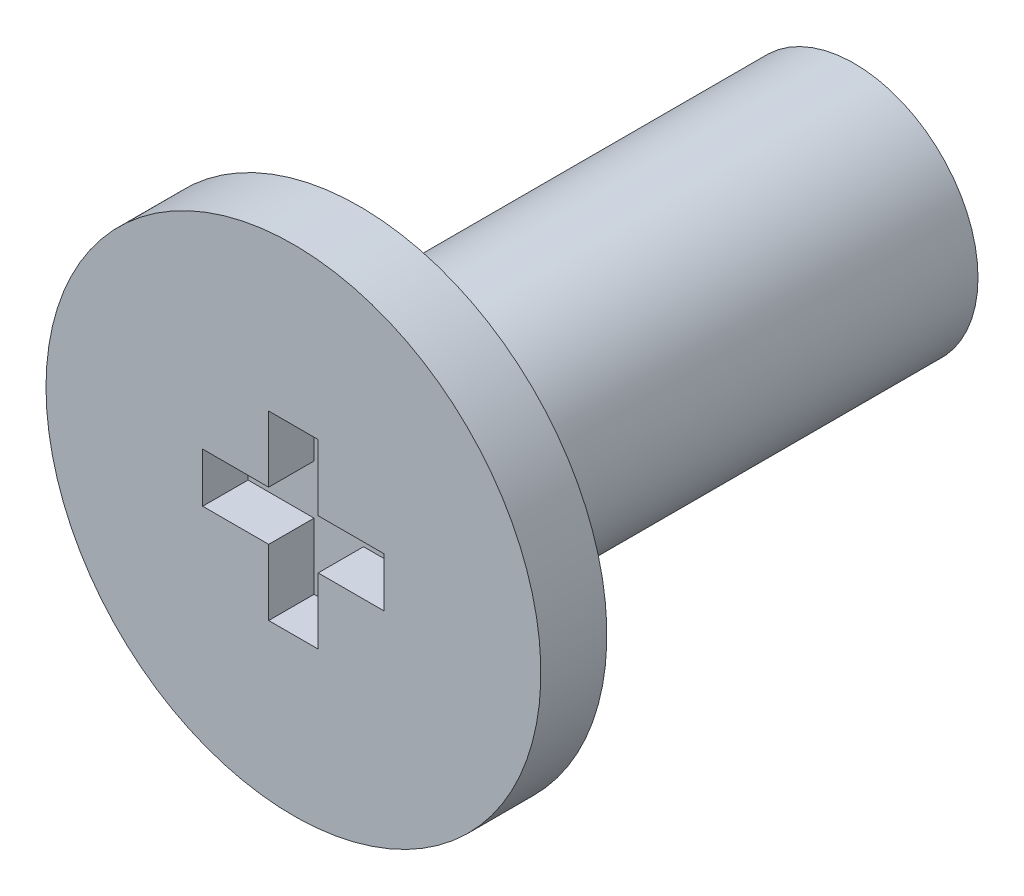
ISO-10303-21;
HEADER;
FILE_DESCRIPTION(('STEP AP214'),'2;1');
FILE_NAME('part.step','',(''),(''),'','','');
FILE_SCHEMA(('AUTOMOTIVE_DESIGN { 1 0 10303 214 1 1 1 1 }'));
ENDSEC;
DATA;
#1=APPLICATION_CONTEXT('core data for automotive mechanical design processes');
#2=APPLICATION_PROTOCOL_DEFINITION('international standard','automotive_design',2000,#1);
#3=PRODUCT_CONTEXT('',#1,'mechanical');
#4=PRODUCT('Part','Part','',(#3));
#5=PRODUCT_RELATED_PRODUCT_CATEGORY('part','',(#4));
#6=PRODUCT_DEFINITION_FORMATION('','',#4);
#7=PRODUCT_DEFINITION_CONTEXT('part definition',#1,'design');
#8=PRODUCT_DEFINITION('design','',#6,#7);
#9=PRODUCT_DEFINITION_SHAPE('','',#8);
#10=(LENGTH_UNIT() NAMED_UNIT(*) SI_UNIT(.MILLI.,.METRE.));
#11=(NAMED_UNIT(*) PLANE_ANGLE_UNIT() SI_UNIT($,.RADIAN.));
#12=(NAMED_UNIT(*) SI_UNIT($,.STERADIAN.) SOLID_ANGLE_UNIT());
#13=UNCERTAINTY_MEASURE_WITH_UNIT(LENGTH_MEASURE(1.E-05),#10,'distance_accuracy_value','');
#14=(GEOMETRIC_REPRESENTATION_CONTEXT(3) GLOBAL_UNCERTAINTY_ASSIGNED_CONTEXT((#13)) GLOBAL_UNIT_ASSIGNED_CONTEXT((#10,
#11,#12)) REPRESENTATION_CONTEXT('',''));
#15=CARTESIAN_POINT('',(0.,0.,0.));
#16=DIRECTION('',(0.,0.,1.));
#17=DIRECTION('',(1.,0.,0.));
#18=AXIS2_PLACEMENT_3D('',#15,#16,#17);
#19=CARTESIAN_POINT('',(0.,0.,-6.));
#20=DIRECTION('',(0.,0.,1.));
#21=DIRECTION('',(1.,0.,0.));
#22=AXIS2_PLACEMENT_3D('',#19,#20,#21);
#23=CYLINDRICAL_SURFACE('',#22,1.5);
#24=CARTESIAN_POINT('',(0.,0.,-6.));
#25=DIRECTION('',(0.,0.,1.));
#26=DIRECTION('',(1.,0.,0.));
#27=AXIS2_PLACEMENT_3D('',#24,#25,#26);
#28=CIRCLE('',#27,1.5);
#29=CARTESIAN_POINT('',(1.5,0.,-6.));
#30=VERTEX_POINT('',#29);
#31=EDGE_CURVE('E212',#30,#30,#28,.T.);
#32=ORIENTED_EDGE('',*,*,#31,.T.);
#33=EDGE_LOOP('',(#32));
#34=FACE_BOUND('',#33,.T.);
#35=CARTESIAN_POINT('',(0.,0.,0.));
#36=DIRECTION('',(0.,0.,1.));
#37=DIRECTION('',(1.,0.,0.));
#38=AXIS2_PLACEMENT_3D('',#35,#36,#37);
#39=CIRCLE('',#38,1.5);
#40=CARTESIAN_POINT('',(1.5,0.,0.));
#41=VERTEX_POINT('',#40);
#42=EDGE_CURVE('E208',#41,#41,#39,.T.);
#43=ORIENTED_EDGE('',*,*,#42,.F.);
#44=EDGE_LOOP('',(#43));
#45=FACE_BOUND('',#44,.T.);
#46=ADVANCED_FACE('F41',(#34,#45),#23,.T.);
#47=CARTESIAN_POINT('',(0.,0.,-6.));
#48=DIRECTION('',(0.,0.,1.));
#49=DIRECTION('',(1.,0.,0.));
#50=AXIS2_PLACEMENT_3D('',#47,#48,#49);
#51=PLANE('',#50);
#52=ORIENTED_EDGE('',*,*,#31,.F.);
#53=EDGE_LOOP('',(#52));
#54=FACE_BOUND('',#53,.T.);
#55=ADVANCED_FACE('F281',(#54),#51,.F.);
#56=CARTESIAN_POINT('',(0.,0.,0.));
#57=DIRECTION('',(0.,0.,1.));
#58=DIRECTION('',(1.,0.,0.));
#59=AXIS2_PLACEMENT_3D('',#56,#57,#58);
#60=PLANE('',#59);
#61=ORIENTED_EDGE('',*,*,#42,.T.);
#62=EDGE_LOOP('',(#61));
#63=FACE_BOUND('',#62,.T.);
#64=CARTESIAN_POINT('',(0.,0.,0.));
#65=DIRECTION('',(0.,0.,-1.));
#66=DIRECTION('',(-1.,0.,0.));
#67=AXIS2_PLACEMENT_3D('',#64,#65,#66);
#68=CIRCLE('',#67,3.);
#69=CARTESIAN_POINT('',(-3.,0.,0.));
#70=VERTEX_POINT('',#69);
#71=EDGE_CURVE('E210',#70,#70,#68,.T.);
#72=ORIENTED_EDGE('',*,*,#71,.T.);
#73=EDGE_LOOP('',(#72));
#74=FACE_BOUND('',#73,.T.);
#75=ADVANCED_FACE('F286',(#63,#74),#60,.F.);
#76=CARTESIAN_POINT('',(0.,0.,-2.));
#77=DIRECTION('',(0.,0.,-1.));
#78=DIRECTION('',(-1.,0.,0.));
#79=AXIS2_PLACEMENT_3D('',#76,#77,#78);
#80=CYLINDRICAL_SURFACE('',#79,3.);
#81=ORIENTED_EDGE('',*,*,#71,.F.);
#82=EDGE_LOOP('',(#81));
#83=FACE_BOUND('',#82,.T.);
#84=CARTESIAN_POINT('',(0.,0.,0.8));
#85=DIRECTION('',(0.,0.,-1.));
#86=DIRECTION('',(-1.,0.,0.));
#87=AXIS2_PLACEMENT_3D('',#84,#85,#86);
#88=CIRCLE('',#87,3.);
#89=CARTESIAN_POINT('',(-3.,0.,0.8));
#90=VERTEX_POINT('',#89);
#91=EDGE_CURVE('E179',#90,#90,#88,.T.);
#92=ORIENTED_EDGE('',*,*,#91,.T.);
#93=EDGE_LOOP('',(#92));
#94=FACE_BOUND('',#93,.T.);
#95=ADVANCED_FACE('F300',(#83,#94),#80,.T.);
#96=CARTESIAN_POINT('',(3.,0.,0.8));
#97=DIRECTION('',(0.,0.,-1.));
#98=DIRECTION('',(-1.,0.,0.));
#99=AXIS2_PLACEMENT_3D('',#96,#97,#98);
#100=PLANE('',#99);
#101=DIRECTION('',(-1.,0.,0.));
#102=VECTOR('',#101,1.);
#103=CARTESIAN_POINT('',(3.,-1.1,0.8));
#104=LINE('',#103,#102);
#105=CARTESIAN_POINT('',(0.3,-1.1,0.8));
#106=VERTEX_POINT('',#105);
#107=CARTESIAN_POINT('',(-0.3,-1.1,0.8));
#108=VERTEX_POINT('',#107);
#109=EDGE_CURVE('E211',#106,#108,#104,.T.);
#110=ORIENTED_EDGE('',*,*,#109,.T.);
#111=DIRECTION('',(0.,1.,0.));
#112=VECTOR('',#111,1.);
#113=CARTESIAN_POINT('',(-0.3,0.,0.8));
#114=LINE('',#113,#112);
#115=CARTESIAN_POINT('',(-0.3,-0.3,0.8));
#116=VERTEX_POINT('',#115);
#117=EDGE_CURVE('E11',#108,#116,#114,.T.);
#118=ORIENTED_EDGE('',*,*,#117,.T.);
#119=DIRECTION('',(-1.,0.,0.));
#120=VECTOR('',#119,1.);
#121=CARTESIAN_POINT('',(3.,-0.3,0.8));
#122=LINE('',#121,#120);
#123=CARTESIAN_POINT('',(-1.1,-0.3,0.8));
#124=VERTEX_POINT('',#123);
#125=EDGE_CURVE('E48',#116,#124,#122,.T.);
#126=ORIENTED_EDGE('',*,*,#125,.T.);
#127=DIRECTION('',(0.,1.,0.));
#128=VECTOR('',#127,1.);
#129=CARTESIAN_POINT('',(-1.1,0.,0.8));
#130=LINE('',#129,#128);
#131=CARTESIAN_POINT('',(-1.1,0.3,0.8));
#132=VERTEX_POINT('',#131);
#133=EDGE_CURVE('E241',#124,#132,#130,.T.);
#134=ORIENTED_EDGE('',*,*,#133,.T.);
#135=DIRECTION('',(1.,0.,0.));
#136=VECTOR('',#135,1.);
#137=CARTESIAN_POINT('',(3.,0.3,0.8));
#138=LINE('',#137,#136);
#139=CARTESIAN_POINT('',(-0.3,0.3,0.8));
#140=VERTEX_POINT('',#139);
#141=EDGE_CURVE('E236',#132,#140,#138,.T.);
#142=ORIENTED_EDGE('',*,*,#141,.T.);
#143=DIRECTION('',(0.,1.,0.));
#144=VECTOR('',#143,1.);
#145=CARTESIAN_POINT('',(-0.3,0.,0.8));
#146=LINE('',#145,#144);
#147=CARTESIAN_POINT('',(-0.3,1.1,0.8));
#148=VERTEX_POINT('',#147);
#149=EDGE_CURVE('E237',#140,#148,#146,.T.);
#150=ORIENTED_EDGE('',*,*,#149,.T.);
#151=DIRECTION('',(1.,0.,0.));
#152=VECTOR('',#151,1.);
#153=CARTESIAN_POINT('',(3.,1.1,0.8));
#154=LINE('',#153,#152);
#155=CARTESIAN_POINT('',(0.3,1.1,0.8));
#156=VERTEX_POINT('',#155);
#157=EDGE_CURVE('E231',#148,#156,#154,.T.);
#158=ORIENTED_EDGE('',*,*,#157,.T.);
#159=DIRECTION('',(0.,-1.,0.));
#160=VECTOR('',#159,1.);
#161=CARTESIAN_POINT('',(0.3,0.,0.8));
#162=LINE('',#161,#160);
#163=CARTESIAN_POINT('',(0.3,0.3,0.8));
#164=VERTEX_POINT('',#163);
#165=EDGE_CURVE('E228',#156,#164,#162,.T.);
#166=ORIENTED_EDGE('',*,*,#165,.T.);
#167=DIRECTION('',(1.,0.,0.));
#168=VECTOR('',#167,1.);
#169=CARTESIAN_POINT('',(3.,0.3,0.8));
#170=LINE('',#169,#168);
#171=CARTESIAN_POINT('',(1.1,0.3,0.8));
#172=VERTEX_POINT('',#171);
#173=EDGE_CURVE('E229',#164,#172,#170,.T.);
#174=ORIENTED_EDGE('',*,*,#173,.T.);
#175=DIRECTION('',(0.,-1.,0.));
#176=VECTOR('',#175,1.);
#177=CARTESIAN_POINT('',(1.1,0.,0.8));
#178=LINE('',#177,#176);
#179=CARTESIAN_POINT('',(1.1,-0.3,0.8));
#180=VERTEX_POINT('',#179);
#181=EDGE_CURVE('E224',#172,#180,#178,.T.);
#182=ORIENTED_EDGE('',*,*,#181,.T.);
#183=DIRECTION('',(-1.,0.,0.));
#184=VECTOR('',#183,1.);
#185=CARTESIAN_POINT('',(3.,-0.3,0.8));
#186=LINE('',#185,#184);
#187=CARTESIAN_POINT('',(0.3,-0.3,0.8));
#188=VERTEX_POINT('',#187);
#189=EDGE_CURVE('E222',#180,#188,#186,.T.);
#190=ORIENTED_EDGE('',*,*,#189,.T.);
#191=DIRECTION('',(0.,-1.,0.));
#192=VECTOR('',#191,1.);
#193=CARTESIAN_POINT('',(0.3,0.,0.8));
#194=LINE('',#193,#192);
#195=EDGE_CURVE('E220',#188,#106,#194,.T.);
#196=ORIENTED_EDGE('',*,*,#195,.T.);
#197=EDGE_LOOP('',(#110,#118,#126,#134,#142,#150,#158,#166,#174,#182,#190,#196));
#198=FACE_BOUND('',#197,.T.);
#199=ORIENTED_EDGE('',*,*,#91,.F.);
#200=EDGE_LOOP('',(#199));
#201=FACE_BOUND('',#200,.T.);
#202=ADVANCED_FACE('F242',(#198,#201),#100,.F.);
#203=CARTESIAN_POINT('',(-0.3,-0.3,0.25));
#204=DIRECTION('',(-1.,0.,0.));
#205=DIRECTION('',(0.,0.,1.));
#206=AXIS2_PLACEMENT_3D('',#203,#204,#205);
#207=PLANE('',#206);
#208=DIRECTION('',(0.,0.,1.));
#209=VECTOR('',#208,1.);
#210=CARTESIAN_POINT('',(-0.3,-1.1,0.25));
#211=LINE('',#210,#209);
#212=CARTESIAN_POINT('',(-0.3,-1.1,0.25));
#213=VERTEX_POINT('',#212);
#214=EDGE_CURVE('E54',#213,#108,#211,.T.);
#215=ORIENTED_EDGE('',*,*,#214,.F.);
#216=DIRECTION('',(0.,-1.,0.));
#217=VECTOR('',#216,1.);
#218=CARTESIAN_POINT('',(-0.3,-0.3,0.25));
#219=LINE('',#218,#217);
#220=CARTESIAN_POINT('',(-0.3,-0.3,0.25));
#221=VERTEX_POINT('',#220);
#222=EDGE_CURVE('E129',#221,#213,#219,.T.);
#223=ORIENTED_EDGE('',*,*,#222,.F.);
#224=DIRECTION('',(0.,0.,1.));
#225=VECTOR('',#224,1.);
#226=CARTESIAN_POINT('',(-0.3,-0.3,0.25));
#227=LINE('',#226,#225);
#228=EDGE_CURVE('E171',#221,#116,#227,.T.);
#229=ORIENTED_EDGE('',*,*,#228,.T.);
#230=ORIENTED_EDGE('',*,*,#117,.F.);
#231=EDGE_LOOP('',(#215,#223,#229,#230));
#232=FACE_BOUND('',#231,.T.);
#233=ADVANCED_FACE('F127',(#232),#207,.F.);
#234=CARTESIAN_POINT('',(-1.1,-0.3,0.25));
#235=DIRECTION('',(0.,-1.,0.));
#236=DIRECTION('',(0.,0.,-1.));
#237=AXIS2_PLACEMENT_3D('',#234,#235,#236);
#238=PLANE('',#237);
#239=ORIENTED_EDGE('',*,*,#228,.F.);
#240=DIRECTION('',(1.,0.,0.));
#241=VECTOR('',#240,1.);
#242=CARTESIAN_POINT('',(-1.1,-0.3,0.25));
#243=LINE('',#242,#241);
#244=CARTESIAN_POINT('',(-1.1,-0.3,0.25));
#245=VERTEX_POINT('',#244);
#246=EDGE_CURVE('E131',#245,#221,#243,.T.);
#247=ORIENTED_EDGE('',*,*,#246,.F.);
#248=DIRECTION('',(0.,0.,1.));
#249=VECTOR('',#248,1.);
#250=CARTESIAN_POINT('',(-1.1,-0.3,0.25));
#251=LINE('',#250,#249);
#252=EDGE_CURVE('E180',#245,#124,#251,.T.);
#253=ORIENTED_EDGE('',*,*,#252,.T.);
#254=ORIENTED_EDGE('',*,*,#125,.F.);
#255=EDGE_LOOP('',(#239,#247,#253,#254));
#256=FACE_BOUND('',#255,.T.);
#257=ADVANCED_FACE('F273',(#256),#238,.F.);
#258=CARTESIAN_POINT('',(-1.1,0.3,0.25));
#259=DIRECTION('',(-1.,0.,0.));
#260=DIRECTION('',(0.,0.,1.));
#261=AXIS2_PLACEMENT_3D('',#258,#259,#260);
#262=PLANE('',#261);
#263=ORIENTED_EDGE('',*,*,#252,.F.);
#264=DIRECTION('',(0.,-1.,0.));
#265=VECTOR('',#264,1.);
#266=CARTESIAN_POINT('',(-1.1,0.3,0.25));
#267=LINE('',#266,#265);
#268=CARTESIAN_POINT('',(-1.1,0.3,0.25));
#269=VERTEX_POINT('',#268);
#270=EDGE_CURVE('E175',#269,#245,#267,.T.);
#271=ORIENTED_EDGE('',*,*,#270,.F.);
#272=DIRECTION('',(0.,0.,1.));
#273=VECTOR('',#272,1.);
#274=CARTESIAN_POINT('',(-1.1,0.3,0.25));
#275=LINE('',#274,#273);
#276=EDGE_CURVE('E178',#269,#132,#275,.T.);
#277=ORIENTED_EDGE('',*,*,#276,.T.);
#278=ORIENTED_EDGE('',*,*,#133,.F.);
#279=EDGE_LOOP('',(#263,#271,#277,#278));
#280=FACE_BOUND('',#279,.T.);
#281=ADVANCED_FACE('F275',(#280),#262,.F.);
#282=CARTESIAN_POINT('',(-0.3,0.3,0.25));
#283=DIRECTION('',(0.,1.,0.));
#284=DIRECTION('',(0.,0.,1.));
#285=AXIS2_PLACEMENT_3D('',#282,#283,#284);
#286=PLANE('',#285);
#287=ORIENTED_EDGE('',*,*,#276,.F.);
#288=DIRECTION('',(-1.,0.,0.));
#289=VECTOR('',#288,1.);
#290=CARTESIAN_POINT('',(-0.3,0.3,0.25));
#291=LINE('',#290,#289);
#292=CARTESIAN_POINT('',(-0.3,0.3,0.25));
#293=VERTEX_POINT('',#292);
#294=EDGE_CURVE('E168',#293,#269,#291,.T.);
#295=ORIENTED_EDGE('',*,*,#294,.F.);
#296=DIRECTION('',(0.,0.,1.));
#297=VECTOR('',#296,1.);
#298=CARTESIAN_POINT('',(-0.3,0.3,0.25));
#299=LINE('',#298,#297);
#300=EDGE_CURVE('E181',#293,#140,#299,.T.);
#301=ORIENTED_EDGE('',*,*,#300,.T.);
#302=ORIENTED_EDGE('',*,*,#141,.F.);
#303=EDGE_LOOP('',(#287,#295,#301,#302));
#304=FACE_BOUND('',#303,.T.);
#305=ADVANCED_FACE('F269',(#304),#286,.F.);
#306=CARTESIAN_POINT('',(-0.3,1.1,0.25));
#307=DIRECTION('',(-1.,0.,0.));
#308=DIRECTION('',(0.,0.,1.));
#309=AXIS2_PLACEMENT_3D('',#306,#307,#308);
#310=PLANE('',#309);
#311=ORIENTED_EDGE('',*,*,#300,.F.);
#312=DIRECTION('',(0.,-1.,0.));
#313=VECTOR('',#312,1.);
#314=CARTESIAN_POINT('',(-0.3,1.1,0.25));
#315=LINE('',#314,#313);
#316=CARTESIAN_POINT('',(-0.3,1.1,0.25));
#317=VERTEX_POINT('',#316);
#318=EDGE_CURVE('E169',#317,#293,#315,.T.);
#319=ORIENTED_EDGE('',*,*,#318,.F.);
#320=DIRECTION('',(0.,0.,1.));
#321=VECTOR('',#320,1.);
#322=CARTESIAN_POINT('',(-0.3,1.1,0.25));
#323=LINE('',#322,#321);
#324=EDGE_CURVE('E188',#317,#148,#323,.T.);
#325=ORIENTED_EDGE('',*,*,#324,.T.);
#326=ORIENTED_EDGE('',*,*,#149,.F.);
#327=EDGE_LOOP('',(#311,#319,#325,#326));
#328=FACE_BOUND('',#327,.T.);
#329=ADVANCED_FACE('F266',(#328),#310,.F.);
#330=CARTESIAN_POINT('',(0.3,1.1,0.25));
#331=DIRECTION('',(0.,1.,0.));
#332=DIRECTION('',(0.,0.,1.));
#333=AXIS2_PLACEMENT_3D('',#330,#331,#332);
#334=PLANE('',#333);
#335=ORIENTED_EDGE('',*,*,#324,.F.);
#336=DIRECTION('',(-1.,0.,0.));
#337=VECTOR('',#336,1.);
#338=CARTESIAN_POINT('',(0.3,1.1,0.25));
#339=LINE('',#338,#337);
#340=CARTESIAN_POINT('',(0.3,1.1,0.25));
#341=VERTEX_POINT('',#340);
#342=EDGE_CURVE('E164',#341,#317,#339,.T.);
#343=ORIENTED_EDGE('',*,*,#342,.F.);
#344=DIRECTION('',(0.,0.,1.));
#345=VECTOR('',#344,1.);
#346=CARTESIAN_POINT('',(0.3,1.1,0.25));
#347=LINE('',#346,#345);
#348=EDGE_CURVE('E189',#341,#156,#347,.T.);
#349=ORIENTED_EDGE('',*,*,#348,.T.);
#350=ORIENTED_EDGE('',*,*,#157,.F.);
#351=EDGE_LOOP('',(#335,#343,#349,#350));
#352=FACE_BOUND('',#351,.T.);
#353=ADVANCED_FACE('F261',(#352),#334,.F.);
#354=CARTESIAN_POINT('',(0.3,0.3,0.25));
#355=DIRECTION('',(1.,0.,0.));
#356=DIRECTION('',(0.,0.,-1.));
#357=AXIS2_PLACEMENT_3D('',#354,#355,#356);
#358=PLANE('',#357);
#359=ORIENTED_EDGE('',*,*,#348,.F.);
#360=DIRECTION('',(0.,1.,0.));
#361=VECTOR('',#360,1.);
#362=CARTESIAN_POINT('',(0.3,0.3,0.25));
#363=LINE('',#362,#361);
#364=CARTESIAN_POINT('',(0.3,0.3,0.25));
#365=VERTEX_POINT('',#364);
#366=EDGE_CURVE('E158',#365,#341,#363,.T.);
#367=ORIENTED_EDGE('',*,*,#366,.F.);
#368=DIRECTION('',(0.,0.,1.));
#369=VECTOR('',#368,1.);
#370=CARTESIAN_POINT('',(0.3,0.3,0.25));
#371=LINE('',#370,#369);
#372=EDGE_CURVE('E195',#365,#164,#371,.T.);
#373=ORIENTED_EDGE('',*,*,#372,.T.);
#374=ORIENTED_EDGE('',*,*,#165,.F.);
#375=EDGE_LOOP('',(#359,#367,#373,#374));
#376=FACE_BOUND('',#375,.T.);
#377=ADVANCED_FACE('F263',(#376),#358,.F.);
#378=CARTESIAN_POINT('',(1.1,0.3,0.25));
#379=DIRECTION('',(0.,1.,0.));
#380=DIRECTION('',(0.,0.,1.));
#381=AXIS2_PLACEMENT_3D('',#378,#379,#380);
#382=PLANE('',#381);
#383=ORIENTED_EDGE('',*,*,#372,.F.);
#384=DIRECTION('',(-1.,0.,0.));
#385=VECTOR('',#384,1.);
#386=CARTESIAN_POINT('',(1.1,0.3,0.25));
#387=LINE('',#386,#385);
#388=CARTESIAN_POINT('',(1.1,0.3,0.25));
#389=VERTEX_POINT('',#388);
#390=EDGE_CURVE('E160',#389,#365,#387,.T.);
#391=ORIENTED_EDGE('',*,*,#390,.F.);
#392=DIRECTION('',(0.,0.,1.));
#393=VECTOR('',#392,1.);
#394=CARTESIAN_POINT('',(1.1,0.3,0.25));
#395=LINE('',#394,#393);
#396=EDGE_CURVE('E194',#389,#172,#395,.T.);
#397=ORIENTED_EDGE('',*,*,#396,.T.);
#398=ORIENTED_EDGE('',*,*,#173,.F.);
#399=EDGE_LOOP('',(#383,#391,#397,#398));
#400=FACE_BOUND('',#399,.T.);
#401=ADVANCED_FACE('F257',(#400),#382,.F.);
#402=CARTESIAN_POINT('',(1.1,-0.3,0.25));
#403=DIRECTION('',(1.,0.,0.));
#404=DIRECTION('',(0.,0.,-1.));
#405=AXIS2_PLACEMENT_3D('',#402,#403,#404);
#406=PLANE('',#405);
#407=ORIENTED_EDGE('',*,*,#396,.F.);
#408=DIRECTION('',(0.,1.,0.));
#409=VECTOR('',#408,1.);
#410=CARTESIAN_POINT('',(1.1,-0.3,0.25));
#411=LINE('',#410,#409);
#412=CARTESIAN_POINT('',(1.1,-0.3,0.25));
#413=VERTEX_POINT('',#412);
#414=EDGE_CURVE('E151',#413,#389,#411,.T.);
#415=ORIENTED_EDGE('',*,*,#414,.F.);
#416=DIRECTION('',(0.,0.,1.));
#417=VECTOR('',#416,1.);
#418=CARTESIAN_POINT('',(1.1,-0.3,0.25));
#419=LINE('',#418,#417);
#420=EDGE_CURVE('E198',#413,#180,#419,.T.);
#421=ORIENTED_EDGE('',*,*,#420,.T.);
#422=ORIENTED_EDGE('',*,*,#181,.F.);
#423=EDGE_LOOP('',(#407,#415,#421,#422));
#424=FACE_BOUND('',#423,.T.);
#425=ADVANCED_FACE('F251',(#424),#406,.F.);
#426=CARTESIAN_POINT('',(0.3,-0.3,0.25));
#427=DIRECTION('',(0.,-1.,0.));
#428=DIRECTION('',(0.,0.,-1.));
#429=AXIS2_PLACEMENT_3D('',#426,#427,#428);
#430=PLANE('',#429);
#431=ORIENTED_EDGE('',*,*,#420,.F.);
#432=DIRECTION('',(1.,0.,0.));
#433=VECTOR('',#432,1.);
#434=CARTESIAN_POINT('',(0.3,-0.3,0.25));
#435=LINE('',#434,#433);
#436=CARTESIAN_POINT('',(0.3,-0.3,0.25));
#437=VERTEX_POINT('',#436);
#438=EDGE_CURVE('E152',#437,#413,#435,.T.);
#439=ORIENTED_EDGE('',*,*,#438,.F.);
#440=DIRECTION('',(0.,0.,1.));
#441=VECTOR('',#440,1.);
#442=CARTESIAN_POINT('',(0.3,-0.3,0.25));
#443=LINE('',#442,#441);
#444=EDGE_CURVE('E201',#437,#188,#443,.T.);
#445=ORIENTED_EDGE('',*,*,#444,.T.);
#446=ORIENTED_EDGE('',*,*,#189,.F.);
#447=EDGE_LOOP('',(#431,#439,#445,#446));
#448=FACE_BOUND('',#447,.T.);
#449=ADVANCED_FACE('F254',(#448),#430,.F.);
#450=CARTESIAN_POINT('',(0.3,-1.1,0.25));
#451=DIRECTION('',(1.,0.,0.));
#452=DIRECTION('',(0.,0.,-1.));
#453=AXIS2_PLACEMENT_3D('',#450,#451,#452);
#454=PLANE('',#453);
#455=ORIENTED_EDGE('',*,*,#444,.F.);
#456=DIRECTION('',(0.,1.,0.));
#457=VECTOR('',#456,1.);
#458=CARTESIAN_POINT('',(0.3,-1.1,0.25));
#459=LINE('',#458,#457);
#460=CARTESIAN_POINT('',(0.3,-1.1,0.25));
#461=VERTEX_POINT('',#460);
#462=EDGE_CURVE('E145',#461,#437,#459,.T.);
#463=ORIENTED_EDGE('',*,*,#462,.F.);
#464=DIRECTION('',(0.,0.,1.));
#465=VECTOR('',#464,1.);
#466=CARTESIAN_POINT('',(0.3,-1.1,0.25));
#467=LINE('',#466,#465);
#468=EDGE_CURVE('E134',#461,#106,#467,.T.);
#469=ORIENTED_EDGE('',*,*,#468,.T.);
#470=ORIENTED_EDGE('',*,*,#195,.F.);
#471=EDGE_LOOP('',(#455,#463,#469,#470));
#472=FACE_BOUND('',#471,.T.);
#473=ADVANCED_FACE('F248',(#472),#454,.F.);
#474=CARTESIAN_POINT('',(-0.3,-1.1,0.25));
#475=DIRECTION('',(0.,-1.,0.));
#476=DIRECTION('',(0.,0.,-1.));
#477=AXIS2_PLACEMENT_3D('',#474,#475,#476);
#478=PLANE('',#477);
#479=ORIENTED_EDGE('',*,*,#468,.F.);
#480=DIRECTION('',(1.,0.,0.));
#481=VECTOR('',#480,1.);
#482=CARTESIAN_POINT('',(-0.3,-1.1,0.25));
#483=LINE('',#482,#481);
#484=EDGE_CURVE('E140',#213,#461,#483,.T.);
#485=ORIENTED_EDGE('',*,*,#484,.F.);
#486=ORIENTED_EDGE('',*,*,#214,.T.);
#487=ORIENTED_EDGE('',*,*,#109,.F.);
#488=EDGE_LOOP('',(#479,#485,#486,#487));
#489=FACE_BOUND('',#488,.T.);
#490=ADVANCED_FACE('F139',(#489),#478,.F.);
#491=CARTESIAN_POINT('',(0.,0.,0.25));
#492=DIRECTION('',(0.,0.,1.));
#493=DIRECTION('',(1.,0.,0.));
#494=AXIS2_PLACEMENT_3D('',#491,#492,#493);
#495=PLANE('',#494);
#496=ORIENTED_EDGE('',*,*,#222,.T.);
#497=ORIENTED_EDGE('',*,*,#484,.T.);
#498=ORIENTED_EDGE('',*,*,#462,.T.);
#499=ORIENTED_EDGE('',*,*,#438,.T.);
#500=ORIENTED_EDGE('',*,*,#414,.T.);
#501=ORIENTED_EDGE('',*,*,#390,.T.);
#502=ORIENTED_EDGE('',*,*,#366,.T.);
#503=ORIENTED_EDGE('',*,*,#342,.T.);
#504=ORIENTED_EDGE('',*,*,#318,.T.);
#505=ORIENTED_EDGE('',*,*,#294,.T.);
#506=ORIENTED_EDGE('',*,*,#270,.T.);
#507=ORIENTED_EDGE('',*,*,#246,.T.);
#508=EDGE_LOOP('',(#496,#497,#498,#499,#500,#501,#502,#503,#504,#505,#506,#507));
#509=FACE_BOUND('',#508,.T.);
#510=ADVANCED_FACE('F142',(#509),#495,.T.);
#511=CLOSED_SHELL('',(#46,#55,#75,#95,#202,#233,#257,#281,#305,#329,#353,#377,#401,#425,#449,
#473,#490,#510));
#512=MANIFOLD_SOLID_BREP('B2',#511);
#513=ADVANCED_BREP_SHAPE_REPRESENTATION('',(#18,#512),#14);
#514=SHAPE_DEFINITION_REPRESENTATION(#9,#513);
ENDSEC;
END-ISO-10303-21;
